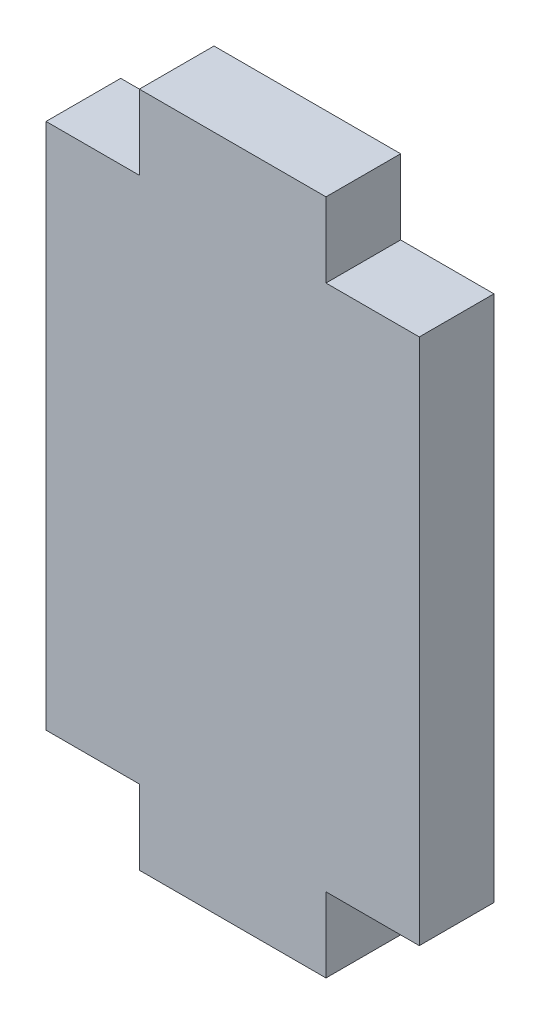
ISO-10303-21;
HEADER;
FILE_DESCRIPTION(('STEP AP214'),'2;1');
FILE_NAME('part.step','',(''),(''),'','','');
FILE_SCHEMA(('AUTOMOTIVE_DESIGN { 1 0 10303 214 1 1 1 1 }'));
ENDSEC;
DATA;
#1=APPLICATION_CONTEXT('core data for automotive mechanical design processes');
#2=APPLICATION_PROTOCOL_DEFINITION('international standard','automotive_design',2000,#1);
#3=PRODUCT_CONTEXT('',#1,'mechanical');
#4=PRODUCT('Part','Part','',(#3));
#5=PRODUCT_RELATED_PRODUCT_CATEGORY('part','',(#4));
#6=PRODUCT_DEFINITION_FORMATION('','',#4);
#7=PRODUCT_DEFINITION_CONTEXT('part definition',#1,'design');
#8=PRODUCT_DEFINITION('design','',#6,#7);
#9=PRODUCT_DEFINITION_SHAPE('','',#8);
#10=(LENGTH_UNIT() NAMED_UNIT(*) SI_UNIT(.MILLI.,.METRE.));
#11=(NAMED_UNIT(*) PLANE_ANGLE_UNIT() SI_UNIT($,.RADIAN.));
#12=(NAMED_UNIT(*) SI_UNIT($,.STERADIAN.) SOLID_ANGLE_UNIT());
#13=UNCERTAINTY_MEASURE_WITH_UNIT(LENGTH_MEASURE(1.E-05),#10,'distance_accuracy_value','');
#14=(GEOMETRIC_REPRESENTATION_CONTEXT(3) GLOBAL_UNCERTAINTY_ASSIGNED_CONTEXT((#13)) GLOBAL_UNIT_ASSIGNED_CONTEXT((#10,
#11,#12)) REPRESENTATION_CONTEXT('',''));
#15=CARTESIAN_POINT('',(0.,0.,0.));
#16=DIRECTION('',(0.,0.,1.));
#17=DIRECTION('',(1.,0.,0.));
#18=AXIS2_PLACEMENT_3D('',#15,#16,#17);
#19=CARTESIAN_POINT('',(10.,-14.125,4.));
#20=DIRECTION('',(-1.,0.,0.));
#21=DIRECTION('',(0.,0.,1.));
#22=AXIS2_PLACEMENT_3D('',#19,#20,#21);
#23=PLANE('',#22);
#24=DIRECTION('',(0.,1.,0.));
#25=VECTOR('',#24,1.);
#26=CARTESIAN_POINT('',(10.,-14.125,0.));
#27=LINE('',#26,#25);
#28=CARTESIAN_POINT('',(10.,-14.125,0.));
#29=VERTEX_POINT('',#28);
#30=CARTESIAN_POINT('',(10.,14.125,0.));
#31=VERTEX_POINT('',#30);
#32=EDGE_CURVE('E164',#29,#31,#27,.T.);
#33=ORIENTED_EDGE('',*,*,#32,.T.);
#34=DIRECTION('',(0.,0.,-1.));
#35=VECTOR('',#34,1.);
#36=CARTESIAN_POINT('',(10.,14.125,4.));
#37=LINE('',#36,#35);
#38=CARTESIAN_POINT('',(10.,14.125,4.));
#39=VERTEX_POINT('',#38);
#40=EDGE_CURVE('E11',#39,#31,#37,.T.);
#41=ORIENTED_EDGE('',*,*,#40,.F.);
#42=DIRECTION('',(0.,1.,0.));
#43=VECTOR('',#42,1.);
#44=CARTESIAN_POINT('',(10.,-14.125,4.));
#45=LINE('',#44,#43);
#46=CARTESIAN_POINT('',(10.,-14.125,4.));
#47=VERTEX_POINT('',#46);
#48=EDGE_CURVE('E198',#47,#39,#45,.T.);
#49=ORIENTED_EDGE('',*,*,#48,.F.);
#50=DIRECTION('',(0.,0.,-1.));
#51=VECTOR('',#50,1.);
#52=CARTESIAN_POINT('',(10.,-14.125,4.));
#53=LINE('',#52,#51);
#54=EDGE_CURVE('E160',#47,#29,#53,.T.);
#55=ORIENTED_EDGE('',*,*,#54,.T.);
#56=EDGE_LOOP('',(#33,#41,#49,#55));
#57=FACE_BOUND('',#56,.T.);
#58=ADVANCED_FACE('F39',(#57),#23,.F.);
#59=CARTESIAN_POINT('',(10.,14.125,4.));
#60=DIRECTION('',(0.,-1.,0.));
#61=DIRECTION('',(0.,0.,-1.));
#62=AXIS2_PLACEMENT_3D('',#59,#60,#61);
#63=PLANE('',#62);
#64=DIRECTION('',(-1.,0.,0.));
#65=VECTOR('',#64,1.);
#66=CARTESIAN_POINT('',(10.,14.125,0.));
#67=LINE('',#66,#65);
#68=CARTESIAN_POINT('',(5.,14.125,0.));
#69=VERTEX_POINT('',#68);
#70=EDGE_CURVE('E168',#31,#69,#67,.T.);
#71=ORIENTED_EDGE('',*,*,#70,.T.);
#72=DIRECTION('',(0.,0.,-1.));
#73=VECTOR('',#72,1.);
#74=CARTESIAN_POINT('',(5.,14.125,4.));
#75=LINE('',#74,#73);
#76=CARTESIAN_POINT('',(5.,14.125,4.));
#77=VERTEX_POINT('',#76);
#78=EDGE_CURVE('E48',#77,#69,#75,.T.);
#79=ORIENTED_EDGE('',*,*,#78,.F.);
#80=DIRECTION('',(-1.,0.,0.));
#81=VECTOR('',#80,1.);
#82=CARTESIAN_POINT('',(10.,14.125,4.));
#83=LINE('',#82,#81);
#84=EDGE_CURVE('E111',#39,#77,#83,.T.);
#85=ORIENTED_EDGE('',*,*,#84,.F.);
#86=ORIENTED_EDGE('',*,*,#40,.T.);
#87=EDGE_LOOP('',(#71,#79,#85,#86));
#88=FACE_BOUND('',#87,.T.);
#89=ADVANCED_FACE('F292',(#88),#63,.F.);
#90=CARTESIAN_POINT('',(5.,14.125,4.));
#91=DIRECTION('',(-1.,0.,0.));
#92=DIRECTION('',(0.,0.,1.));
#93=AXIS2_PLACEMENT_3D('',#90,#91,#92);
#94=PLANE('',#93);
#95=DIRECTION('',(0.,1.,0.));
#96=VECTOR('',#95,1.);
#97=CARTESIAN_POINT('',(5.,14.125,0.));
#98=LINE('',#97,#96);
#99=CARTESIAN_POINT('',(5.,18.125,0.));
#100=VERTEX_POINT('',#99);
#101=EDGE_CURVE('E171',#69,#100,#98,.T.);
#102=ORIENTED_EDGE('',*,*,#101,.T.);
#103=DIRECTION('',(0.,0.,-1.));
#104=VECTOR('',#103,1.);
#105=CARTESIAN_POINT('',(5.,18.125,4.));
#106=LINE('',#105,#104);
#107=CARTESIAN_POINT('',(5.,18.125,4.));
#108=VERTEX_POINT('',#107);
#109=EDGE_CURVE('E225',#108,#100,#106,.T.);
#110=ORIENTED_EDGE('',*,*,#109,.F.);
#111=DIRECTION('',(0.,1.,0.));
#112=VECTOR('',#111,1.);
#113=CARTESIAN_POINT('',(5.,14.125,4.));
#114=LINE('',#113,#112);
#115=EDGE_CURVE('E235',#77,#108,#114,.T.);
#116=ORIENTED_EDGE('',*,*,#115,.F.);
#117=ORIENTED_EDGE('',*,*,#78,.T.);
#118=EDGE_LOOP('',(#102,#110,#116,#117));
#119=FACE_BOUND('',#118,.T.);
#120=ADVANCED_FACE('F233',(#119),#94,.F.);
#121=CARTESIAN_POINT('',(5.,18.125,4.));
#122=DIRECTION('',(0.,-1.,0.));
#123=DIRECTION('',(0.,0.,-1.));
#124=AXIS2_PLACEMENT_3D('',#121,#122,#123);
#125=PLANE('',#124);
#126=DIRECTION('',(-1.,0.,0.));
#127=VECTOR('',#126,1.);
#128=CARTESIAN_POINT('',(5.,18.125,0.));
#129=LINE('',#128,#127);
#130=CARTESIAN_POINT('',(-5.,18.125,0.));
#131=VERTEX_POINT('',#130);
#132=EDGE_CURVE('E174',#100,#131,#129,.T.);
#133=ORIENTED_EDGE('',*,*,#132,.T.);
#134=DIRECTION('',(0.,0.,-1.));
#135=VECTOR('',#134,1.);
#136=CARTESIAN_POINT('',(-5.,18.125,4.));
#137=LINE('',#136,#135);
#138=CARTESIAN_POINT('',(-5.,18.125,4.));
#139=VERTEX_POINT('',#138);
#140=EDGE_CURVE('E221',#139,#131,#137,.T.);
#141=ORIENTED_EDGE('',*,*,#140,.F.);
#142=DIRECTION('',(-1.,0.,0.));
#143=VECTOR('',#142,1.);
#144=CARTESIAN_POINT('',(5.,18.125,4.));
#145=LINE('',#144,#143);
#146=EDGE_CURVE('E254',#108,#139,#145,.T.);
#147=ORIENTED_EDGE('',*,*,#146,.F.);
#148=ORIENTED_EDGE('',*,*,#109,.T.);
#149=EDGE_LOOP('',(#133,#141,#147,#148));
#150=FACE_BOUND('',#149,.T.);
#151=ADVANCED_FACE('F244',(#150),#125,.F.);
#152=CARTESIAN_POINT('',(-5.,18.125,4.));
#153=DIRECTION('',(1.,0.,0.));
#154=DIRECTION('',(0.,0.,-1.));
#155=AXIS2_PLACEMENT_3D('',#152,#153,#154);
#156=PLANE('',#155);
#157=DIRECTION('',(0.,-1.,0.));
#158=VECTOR('',#157,1.);
#159=CARTESIAN_POINT('',(-5.,18.125,0.));
#160=LINE('',#159,#158);
#161=CARTESIAN_POINT('',(-5.,14.125,0.));
#162=VERTEX_POINT('',#161);
#163=EDGE_CURVE('E177',#131,#162,#160,.T.);
#164=ORIENTED_EDGE('',*,*,#163,.T.);
#165=DIRECTION('',(0.,0.,-1.));
#166=VECTOR('',#165,1.);
#167=CARTESIAN_POINT('',(-5.,14.125,4.));
#168=LINE('',#167,#166);
#169=CARTESIAN_POINT('',(-5.,14.125,4.));
#170=VERTEX_POINT('',#169);
#171=EDGE_CURVE('E217',#170,#162,#168,.T.);
#172=ORIENTED_EDGE('',*,*,#171,.F.);
#173=DIRECTION('',(0.,-1.,0.));
#174=VECTOR('',#173,1.);
#175=CARTESIAN_POINT('',(-5.,18.125,4.));
#176=LINE('',#175,#174);
#177=EDGE_CURVE('E250',#139,#170,#176,.T.);
#178=ORIENTED_EDGE('',*,*,#177,.F.);
#179=ORIENTED_EDGE('',*,*,#140,.T.);
#180=EDGE_LOOP('',(#164,#172,#178,#179));
#181=FACE_BOUND('',#180,.T.);
#182=ADVANCED_FACE('F248',(#181),#156,.F.);
#183=CARTESIAN_POINT('',(-5.,14.125,4.));
#184=DIRECTION('',(0.,-1.,0.));
#185=DIRECTION('',(0.,0.,-1.));
#186=AXIS2_PLACEMENT_3D('',#183,#184,#185);
#187=PLANE('',#186);
#188=DIRECTION('',(-1.,0.,0.));
#189=VECTOR('',#188,1.);
#190=CARTESIAN_POINT('',(-5.,14.125,0.));
#191=LINE('',#190,#189);
#192=CARTESIAN_POINT('',(-10.,14.125,0.));
#193=VERTEX_POINT('',#192);
#194=EDGE_CURVE('E180',#162,#193,#191,.T.);
#195=ORIENTED_EDGE('',*,*,#194,.T.);
#196=DIRECTION('',(0.,0.,-1.));
#197=VECTOR('',#196,1.);
#198=CARTESIAN_POINT('',(-10.,14.125,4.));
#199=LINE('',#198,#197);
#200=CARTESIAN_POINT('',(-10.,14.125,4.));
#201=VERTEX_POINT('',#200);
#202=EDGE_CURVE('E213',#201,#193,#199,.T.);
#203=ORIENTED_EDGE('',*,*,#202,.F.);
#204=DIRECTION('',(-1.,0.,0.));
#205=VECTOR('',#204,1.);
#206=CARTESIAN_POINT('',(-5.,14.125,4.));
#207=LINE('',#206,#205);
#208=EDGE_CURVE('E253',#170,#201,#207,.T.);
#209=ORIENTED_EDGE('',*,*,#208,.F.);
#210=ORIENTED_EDGE('',*,*,#171,.T.);
#211=EDGE_LOOP('',(#195,#203,#209,#210));
#212=FACE_BOUND('',#211,.T.);
#213=ADVANCED_FACE('F305',(#212),#187,.F.);
#214=CARTESIAN_POINT('',(-10.,14.125,4.));
#215=DIRECTION('',(1.,0.,0.));
#216=DIRECTION('',(0.,0.,-1.));
#217=AXIS2_PLACEMENT_3D('',#214,#215,#216);
#218=PLANE('',#217);
#219=DIRECTION('',(0.,-1.,0.));
#220=VECTOR('',#219,1.);
#221=CARTESIAN_POINT('',(-10.,14.125,0.));
#222=LINE('',#221,#220);
#223=CARTESIAN_POINT('',(-10.,-14.125,0.));
#224=VERTEX_POINT('',#223);
#225=EDGE_CURVE('E183',#193,#224,#222,.T.);
#226=ORIENTED_EDGE('',*,*,#225,.T.);
#227=DIRECTION('',(0.,0.,-1.));
#228=VECTOR('',#227,1.);
#229=CARTESIAN_POINT('',(-10.,-14.125,4.));
#230=LINE('',#229,#228);
#231=CARTESIAN_POINT('',(-10.,-14.125,4.));
#232=VERTEX_POINT('',#231);
#233=EDGE_CURVE('E209',#232,#224,#230,.T.);
#234=ORIENTED_EDGE('',*,*,#233,.F.);
#235=DIRECTION('',(0.,-1.,0.));
#236=VECTOR('',#235,1.);
#237=CARTESIAN_POINT('',(-10.,14.125,4.));
#238=LINE('',#237,#236);
#239=EDGE_CURVE('E258',#201,#232,#238,.T.);
#240=ORIENTED_EDGE('',*,*,#239,.F.);
#241=ORIENTED_EDGE('',*,*,#202,.T.);
#242=EDGE_LOOP('',(#226,#234,#240,#241));
#243=FACE_BOUND('',#242,.T.);
#244=ADVANCED_FACE('F308',(#243),#218,.F.);
#245=CARTESIAN_POINT('',(-10.,-14.125,4.));
#246=DIRECTION('',(0.,1.,0.));
#247=DIRECTION('',(-1.,0.,0.));
#248=AXIS2_PLACEMENT_3D('',#245,#246,#247);
#249=PLANE('',#248);
#250=DIRECTION('',(1.,0.,0.));
#251=VECTOR('',#250,1.);
#252=CARTESIAN_POINT('',(-10.,-14.125,0.));
#253=LINE('',#252,#251);
#254=CARTESIAN_POINT('',(-5.,-14.125,0.));
#255=VERTEX_POINT('',#254);
#256=EDGE_CURVE('E186',#224,#255,#253,.T.);
#257=ORIENTED_EDGE('',*,*,#256,.T.);
#258=DIRECTION('',(0.,0.,-1.));
#259=VECTOR('',#258,1.);
#260=CARTESIAN_POINT('',(-5.,-14.125,4.));
#261=LINE('',#260,#259);
#262=CARTESIAN_POINT('',(-5.,-14.125,4.));
#263=VERTEX_POINT('',#262);
#264=EDGE_CURVE('E205',#263,#255,#261,.T.);
#265=ORIENTED_EDGE('',*,*,#264,.F.);
#266=DIRECTION('',(1.,0.,0.));
#267=VECTOR('',#266,1.);
#268=CARTESIAN_POINT('',(-10.,-14.125,4.));
#269=LINE('',#268,#267);
#270=EDGE_CURVE('E265',#232,#263,#269,.T.);
#271=ORIENTED_EDGE('',*,*,#270,.F.);
#272=ORIENTED_EDGE('',*,*,#233,.T.);
#273=EDGE_LOOP('',(#257,#265,#271,#272));
#274=FACE_BOUND('',#273,.T.);
#275=ADVANCED_FACE('F273',(#274),#249,.F.);
#276=CARTESIAN_POINT('',(-5.,-14.125,4.));
#277=DIRECTION('',(1.,0.,0.));
#278=DIRECTION('',(0.,1.,0.));
#279=AXIS2_PLACEMENT_3D('',#276,#277,#278);
#280=PLANE('',#279);
#281=DIRECTION('',(0.,-1.,0.));
#282=VECTOR('',#281,1.);
#283=CARTESIAN_POINT('',(-5.,-14.125,0.));
#284=LINE('',#283,#282);
#285=CARTESIAN_POINT('',(-5.,-18.125,0.));
#286=VERTEX_POINT('',#285);
#287=EDGE_CURVE('E189',#255,#286,#284,.T.);
#288=ORIENTED_EDGE('',*,*,#287,.T.);
#289=DIRECTION('',(0.,0.,-1.));
#290=VECTOR('',#289,1.);
#291=CARTESIAN_POINT('',(-5.,-18.125,4.));
#292=LINE('',#291,#290);
#293=CARTESIAN_POINT('',(-5.,-18.125,4.));
#294=VERTEX_POINT('',#293);
#295=EDGE_CURVE('E153',#294,#286,#292,.T.);
#296=ORIENTED_EDGE('',*,*,#295,.F.);
#297=DIRECTION('',(0.,-1.,0.));
#298=VECTOR('',#297,1.);
#299=CARTESIAN_POINT('',(-5.,-14.125,4.));
#300=LINE('',#299,#298);
#301=EDGE_CURVE('E142',#263,#294,#300,.T.);
#302=ORIENTED_EDGE('',*,*,#301,.F.);
#303=ORIENTED_EDGE('',*,*,#264,.T.);
#304=EDGE_LOOP('',(#288,#296,#302,#303));
#305=FACE_BOUND('',#304,.T.);
#306=ADVANCED_FACE('F277',(#305),#280,.F.);
#307=CARTESIAN_POINT('',(-5.,-18.125,4.));
#308=DIRECTION('',(0.,1.,0.));
#309=DIRECTION('',(0.,0.,1.));
#310=AXIS2_PLACEMENT_3D('',#307,#308,#309);
#311=PLANE('',#310);
#312=DIRECTION('',(1.,0.,0.));
#313=VECTOR('',#312,1.);
#314=CARTESIAN_POINT('',(-5.,-18.125,0.));
#315=LINE('',#314,#313);
#316=CARTESIAN_POINT('',(5.,-18.125,0.));
#317=VERTEX_POINT('',#316);
#318=EDGE_CURVE('E151',#286,#317,#315,.T.);
#319=ORIENTED_EDGE('',*,*,#318,.T.);
#320=DIRECTION('',(0.,0.,-1.));
#321=VECTOR('',#320,1.);
#322=CARTESIAN_POINT('',(5.,-18.125,4.));
#323=LINE('',#322,#321);
#324=CARTESIAN_POINT('',(5.,-18.125,4.));
#325=VERTEX_POINT('',#324);
#326=EDGE_CURVE('E148',#325,#317,#323,.T.);
#327=ORIENTED_EDGE('',*,*,#326,.F.);
#328=DIRECTION('',(1.,0.,0.));
#329=VECTOR('',#328,1.);
#330=CARTESIAN_POINT('',(-5.,-18.125,4.));
#331=LINE('',#330,#329);
#332=EDGE_CURVE('E136',#294,#325,#331,.T.);
#333=ORIENTED_EDGE('',*,*,#332,.F.);
#334=ORIENTED_EDGE('',*,*,#295,.T.);
#335=EDGE_LOOP('',(#319,#327,#333,#334));
#336=FACE_BOUND('',#335,.T.);
#337=ADVANCED_FACE('F149',(#336),#311,.F.);
#338=CARTESIAN_POINT('',(5.,-18.125,4.));
#339=DIRECTION('',(-1.,0.,0.));
#340=DIRECTION('',(0.,-1.,0.));
#341=AXIS2_PLACEMENT_3D('',#338,#339,#340);
#342=PLANE('',#341);
#343=DIRECTION('',(0.,1.,0.));
#344=VECTOR('',#343,1.);
#345=CARTESIAN_POINT('',(5.,-18.125,0.));
#346=LINE('',#345,#344);
#347=CARTESIAN_POINT('',(5.,-14.125,0.));
#348=VERTEX_POINT('',#347);
#349=EDGE_CURVE('E97',#317,#348,#346,.T.);
#350=ORIENTED_EDGE('',*,*,#349,.T.);
#351=DIRECTION('',(0.,0.,-1.));
#352=VECTOR('',#351,1.);
#353=CARTESIAN_POINT('',(5.,-14.125,4.));
#354=LINE('',#353,#352);
#355=CARTESIAN_POINT('',(5.,-14.125,4.));
#356=VERTEX_POINT('',#355);
#357=EDGE_CURVE('E154',#356,#348,#354,.T.);
#358=ORIENTED_EDGE('',*,*,#357,.F.);
#359=DIRECTION('',(0.,1.,0.));
#360=VECTOR('',#359,1.);
#361=CARTESIAN_POINT('',(5.,-18.125,4.));
#362=LINE('',#361,#360);
#363=EDGE_CURVE('E140',#325,#356,#362,.T.);
#364=ORIENTED_EDGE('',*,*,#363,.F.);
#365=ORIENTED_EDGE('',*,*,#326,.T.);
#366=EDGE_LOOP('',(#350,#358,#364,#365));
#367=FACE_BOUND('',#366,.T.);
#368=ADVANCED_FACE('F156',(#367),#342,.F.);
#369=CARTESIAN_POINT('',(5.,-14.125,4.));
#370=DIRECTION('',(0.,1.,0.));
#371=DIRECTION('',(0.,0.,1.));
#372=AXIS2_PLACEMENT_3D('',#369,#370,#371);
#373=PLANE('',#372);
#374=DIRECTION('',(1.,0.,0.));
#375=VECTOR('',#374,1.);
#376=CARTESIAN_POINT('',(5.,-14.125,0.));
#377=LINE('',#376,#375);
#378=EDGE_CURVE('E103',#348,#29,#377,.T.);
#379=ORIENTED_EDGE('',*,*,#378,.T.);
#380=ORIENTED_EDGE('',*,*,#54,.F.);
#381=DIRECTION('',(1.,0.,0.));
#382=VECTOR('',#381,1.);
#383=CARTESIAN_POINT('',(5.,-14.125,4.));
#384=LINE('',#383,#382);
#385=EDGE_CURVE('E56',#356,#47,#384,.T.);
#386=ORIENTED_EDGE('',*,*,#385,.F.);
#387=ORIENTED_EDGE('',*,*,#357,.T.);
#388=EDGE_LOOP('',(#379,#380,#386,#387));
#389=FACE_BOUND('',#388,.T.);
#390=ADVANCED_FACE('F281',(#389),#373,.F.);
#391=CARTESIAN_POINT('',(0.,0.,4.));
#392=DIRECTION('',(0.,0.,1.));
#393=DIRECTION('',(1.,0.,0.));
#394=AXIS2_PLACEMENT_3D('',#391,#392,#393);
#395=PLANE('',#394);
#396=ORIENTED_EDGE('',*,*,#48,.T.);
#397=ORIENTED_EDGE('',*,*,#84,.T.);
#398=ORIENTED_EDGE('',*,*,#115,.T.);
#399=ORIENTED_EDGE('',*,*,#146,.T.);
#400=ORIENTED_EDGE('',*,*,#177,.T.);
#401=ORIENTED_EDGE('',*,*,#208,.T.);
#402=ORIENTED_EDGE('',*,*,#239,.T.);
#403=ORIENTED_EDGE('',*,*,#270,.T.);
#404=ORIENTED_EDGE('',*,*,#301,.T.);
#405=ORIENTED_EDGE('',*,*,#332,.T.);
#406=ORIENTED_EDGE('',*,*,#363,.T.);
#407=ORIENTED_EDGE('',*,*,#385,.T.);
#408=EDGE_LOOP('',(#396,#397,#398,#399,#400,#401,#402,#403,#404,#405,#406,#407));
#409=FACE_BOUND('',#408,.T.);
#410=ADVANCED_FACE('F138',(#409),#395,.T.);
#411=CARTESIAN_POINT('',(0.,0.,0.));
#412=DIRECTION('',(0.,0.,1.));
#413=DIRECTION('',(1.,0.,0.));
#414=AXIS2_PLACEMENT_3D('',#411,#412,#413);
#415=PLANE('',#414);
#416=ORIENTED_EDGE('',*,*,#32,.F.);
#417=ORIENTED_EDGE('',*,*,#378,.F.);
#418=ORIENTED_EDGE('',*,*,#349,.F.);
#419=ORIENTED_EDGE('',*,*,#318,.F.);
#420=ORIENTED_EDGE('',*,*,#287,.F.);
#421=ORIENTED_EDGE('',*,*,#256,.F.);
#422=ORIENTED_EDGE('',*,*,#225,.F.);
#423=ORIENTED_EDGE('',*,*,#194,.F.);
#424=ORIENTED_EDGE('',*,*,#163,.F.);
#425=ORIENTED_EDGE('',*,*,#132,.F.);
#426=ORIENTED_EDGE('',*,*,#101,.F.);
#427=ORIENTED_EDGE('',*,*,#70,.F.);
#428=EDGE_LOOP('',(#416,#417,#418,#419,#420,#421,#422,#423,#424,#425,#426,#427));
#429=FACE_BOUND('',#428,.T.);
#430=ADVANCED_FACE('F239',(#429),#415,.F.);
#431=CLOSED_SHELL('',(#58,#89,#120,#151,#182,#213,#244,#275,#306,#337,#368,#390,#410,#430));
#432=MANIFOLD_SOLID_BREP('B2',#431);
#433=ADVANCED_BREP_SHAPE_REPRESENTATION('',(#18,#432),#14);
#434=SHAPE_DEFINITION_REPRESENTATION(#9,#433);
ENDSEC;
END-ISO-10303-21;
